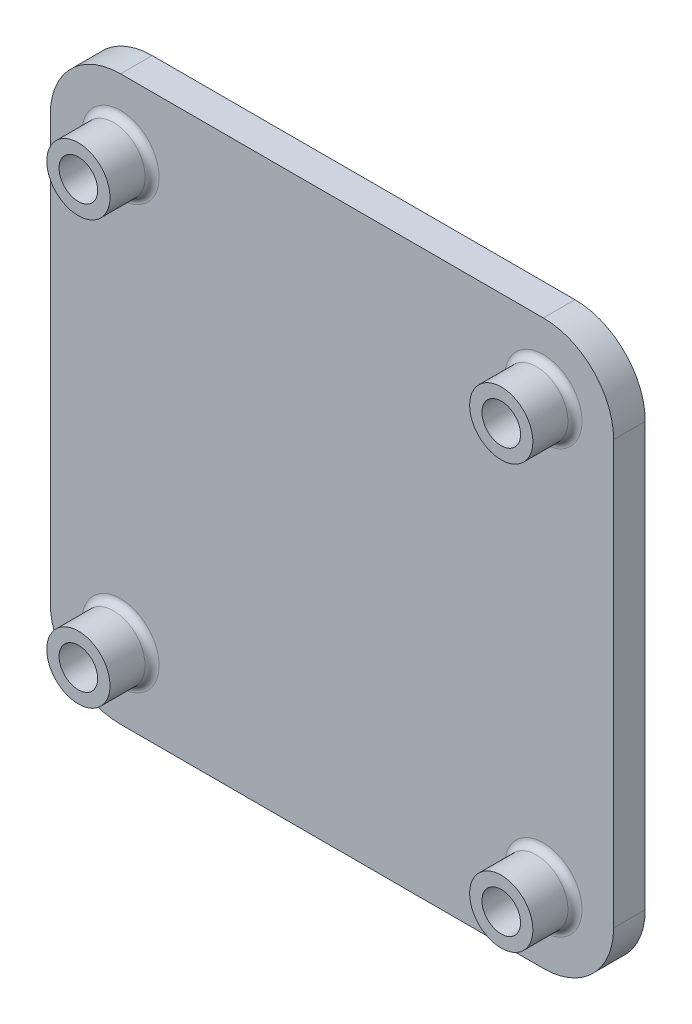
ISO-10303-21;
HEADER;
FILE_DESCRIPTION(('STEP AP214'),'2;1');
FILE_NAME('part.step','',(''),(''),'','','');
FILE_SCHEMA(('AUTOMOTIVE_DESIGN { 1 0 10303 214 1 1 1 1 }'));
ENDSEC;
DATA;
#1=APPLICATION_CONTEXT('core data for automotive mechanical design processes');
#2=APPLICATION_PROTOCOL_DEFINITION('international standard','automotive_design',2000,#1);
#3=PRODUCT_CONTEXT('',#1,'mechanical');
#4=PRODUCT('Part','Part','',(#3));
#5=PRODUCT_RELATED_PRODUCT_CATEGORY('part','',(#4));
#6=PRODUCT_DEFINITION_FORMATION('','',#4);
#7=PRODUCT_DEFINITION_CONTEXT('part definition',#1,'design');
#8=PRODUCT_DEFINITION('design','',#6,#7);
#9=PRODUCT_DEFINITION_SHAPE('','',#8);
#10=(LENGTH_UNIT() NAMED_UNIT(*) SI_UNIT(.MILLI.,.METRE.));
#11=(NAMED_UNIT(*) PLANE_ANGLE_UNIT() SI_UNIT($,.RADIAN.));
#12=(NAMED_UNIT(*) SI_UNIT($,.STERADIAN.) SOLID_ANGLE_UNIT());
#13=UNCERTAINTY_MEASURE_WITH_UNIT(LENGTH_MEASURE(1.E-05),#10,'distance_accuracy_value','');
#14=(GEOMETRIC_REPRESENTATION_CONTEXT(3) GLOBAL_UNCERTAINTY_ASSIGNED_CONTEXT((#13)) GLOBAL_UNIT_ASSIGNED_CONTEXT((#10,
#11,#12)) REPRESENTATION_CONTEXT('',''));
#15=CARTESIAN_POINT('',(0.,0.,0.));
#16=DIRECTION('',(0.,0.,1.));
#17=DIRECTION('',(1.,0.,0.));
#18=AXIS2_PLACEMENT_3D('',#15,#16,#17);
#19=CARTESIAN_POINT('',(40.1,-40.1,4.5));
#20=DIRECTION('',(-1.,0.,0.));
#21=DIRECTION('',(0.,0.,1.));
#22=AXIS2_PLACEMENT_3D('',#19,#20,#21);
#23=PLANE('',#22);
#24=DIRECTION('',(0.,1.,0.));
#25=VECTOR('',#24,1.);
#26=CARTESIAN_POINT('',(40.1,-40.1,4.5));
#27=LINE('',#26,#25);
#28=CARTESIAN_POINT('',(40.1,-30.1,4.5));
#29=VERTEX_POINT('',#28);
#30=CARTESIAN_POINT('',(40.1,30.1,4.5));
#31=VERTEX_POINT('',#30);
#32=EDGE_CURVE('E121',#29,#31,#27,.T.);
#33=ORIENTED_EDGE('',*,*,#32,.F.);
#34=DIRECTION('',(0.,0.,-1.));
#35=VECTOR('',#34,1.);
#36=CARTESIAN_POINT('',(40.1,-30.1,4.5));
#37=LINE('',#36,#35);
#38=CARTESIAN_POINT('',(40.1,-30.1,0.));
#39=VERTEX_POINT('',#38);
#40=EDGE_CURVE('E106',#29,#39,#37,.T.);
#41=ORIENTED_EDGE('',*,*,#40,.T.);
#42=DIRECTION('',(0.,1.,0.));
#43=VECTOR('',#42,1.);
#44=CARTESIAN_POINT('',(40.1,-40.1,0.));
#45=LINE('',#44,#43);
#46=CARTESIAN_POINT('',(40.1,30.1,0.));
#47=VERTEX_POINT('',#46);
#48=EDGE_CURVE('E118',#39,#47,#45,.T.);
#49=ORIENTED_EDGE('',*,*,#48,.T.);
#50=DIRECTION('',(0.,0.,-1.));
#51=VECTOR('',#50,1.);
#52=CARTESIAN_POINT('',(40.1,30.1,4.5));
#53=LINE('',#52,#51);
#54=EDGE_CURVE('E123',#47,#31,#53,.F.);
#55=ORIENTED_EDGE('',*,*,#54,.T.);
#56=EDGE_LOOP('',(#33,#41,#49,#55));
#57=FACE_BOUND('',#56,.T.);
#58=ADVANCED_FACE('F35',(#57),#23,.F.);
#59=CARTESIAN_POINT('',(-40.1,40.1,4.5));
#60=DIRECTION('',(0.,-1.,0.));
#61=DIRECTION('',(0.,0.,-1.));
#62=AXIS2_PLACEMENT_3D('',#59,#60,#61);
#63=PLANE('',#62);
#64=DIRECTION('',(-1.,0.,0.));
#65=VECTOR('',#64,1.);
#66=CARTESIAN_POINT('',(-40.1,40.1,0.));
#67=LINE('',#66,#65);
#68=CARTESIAN_POINT('',(30.1,40.1,0.));
#69=VERTEX_POINT('',#68);
#70=CARTESIAN_POINT('',(-30.1,40.1,0.));
#71=VERTEX_POINT('',#70);
#72=EDGE_CURVE('E127',#69,#71,#67,.T.);
#73=ORIENTED_EDGE('',*,*,#72,.T.);
#74=DIRECTION('',(0.,0.,-1.));
#75=VECTOR('',#74,1.);
#76=CARTESIAN_POINT('',(-30.1,40.1,4.5));
#77=LINE('',#76,#75);
#78=CARTESIAN_POINT('',(-30.1,40.1,4.5));
#79=VERTEX_POINT('',#78);
#80=EDGE_CURVE('E165',#71,#79,#77,.F.);
#81=ORIENTED_EDGE('',*,*,#80,.T.);
#82=DIRECTION('',(-1.,0.,0.));
#83=VECTOR('',#82,1.);
#84=CARTESIAN_POINT('',(-40.1,40.1,4.5));
#85=LINE('',#84,#83);
#86=CARTESIAN_POINT('',(30.1,40.1,4.5));
#87=VERTEX_POINT('',#86);
#88=EDGE_CURVE('E266',#87,#79,#85,.T.);
#89=ORIENTED_EDGE('',*,*,#88,.F.);
#90=DIRECTION('',(0.,0.,-1.));
#91=VECTOR('',#90,1.);
#92=CARTESIAN_POINT('',(30.1,40.1,4.5));
#93=LINE('',#92,#91);
#94=EDGE_CURVE('E162',#87,#69,#93,.T.);
#95=ORIENTED_EDGE('',*,*,#94,.T.);
#96=EDGE_LOOP('',(#73,#81,#89,#95));
#97=FACE_BOUND('',#96,.T.);
#98=ADVANCED_FACE('F204',(#97),#63,.F.);
#99=CARTESIAN_POINT('',(-40.1,-40.1,4.5));
#100=DIRECTION('',(1.,0.,0.));
#101=DIRECTION('',(0.,0.,-1.));
#102=AXIS2_PLACEMENT_3D('',#99,#100,#101);
#103=PLANE('',#102);
#104=DIRECTION('',(0.,-1.,0.));
#105=VECTOR('',#104,1.);
#106=CARTESIAN_POINT('',(-40.1,-40.1,0.));
#107=LINE('',#106,#105);
#108=CARTESIAN_POINT('',(-40.1,30.1,0.));
#109=VERTEX_POINT('',#108);
#110=CARTESIAN_POINT('',(-40.1,-30.1,0.));
#111=VERTEX_POINT('',#110);
#112=EDGE_CURVE('E131',#109,#111,#107,.T.);
#113=ORIENTED_EDGE('',*,*,#112,.T.);
#114=DIRECTION('',(0.,0.,-1.));
#115=VECTOR('',#114,1.);
#116=CARTESIAN_POINT('',(-40.1,-30.1,4.5));
#117=LINE('',#116,#115);
#118=CARTESIAN_POINT('',(-40.1,-30.1,4.5));
#119=VERTEX_POINT('',#118);
#120=EDGE_CURVE('E50',#111,#119,#117,.F.);
#121=ORIENTED_EDGE('',*,*,#120,.T.);
#122=DIRECTION('',(0.,-1.,0.));
#123=VECTOR('',#122,1.);
#124=CARTESIAN_POINT('',(-40.1,-40.1,4.5));
#125=LINE('',#124,#123);
#126=CARTESIAN_POINT('',(-40.1,30.1,4.5));
#127=VERTEX_POINT('',#126);
#128=EDGE_CURVE('E267',#127,#119,#125,.T.);
#129=ORIENTED_EDGE('',*,*,#128,.F.);
#130=DIRECTION('',(0.,0.,-1.));
#131=VECTOR('',#130,1.);
#132=CARTESIAN_POINT('',(-40.1,30.1,4.5));
#133=LINE('',#132,#131);
#134=EDGE_CURVE('E158',#127,#109,#133,.T.);
#135=ORIENTED_EDGE('',*,*,#134,.T.);
#136=EDGE_LOOP('',(#113,#121,#129,#135));
#137=FACE_BOUND('',#136,.T.);
#138=ADVANCED_FACE('F209',(#137),#103,.F.);
#139=CARTESIAN_POINT('',(-40.1,-40.1,4.5));
#140=DIRECTION('',(0.,1.,0.));
#141=DIRECTION('',(0.,0.,1.));
#142=AXIS2_PLACEMENT_3D('',#139,#140,#141);
#143=PLANE('',#142);
#144=DIRECTION('',(1.,0.,0.));
#145=VECTOR('',#144,1.);
#146=CARTESIAN_POINT('',(-40.1,-40.1,0.));
#147=LINE('',#146,#145);
#148=CARTESIAN_POINT('',(-30.1,-40.1,0.));
#149=VERTEX_POINT('',#148);
#150=CARTESIAN_POINT('',(30.1,-40.1,0.));
#151=VERTEX_POINT('',#150);
#152=EDGE_CURVE('E141',#149,#151,#147,.T.);
#153=ORIENTED_EDGE('',*,*,#152,.T.);
#154=DIRECTION('',(0.,0.,-1.));
#155=VECTOR('',#154,1.);
#156=CARTESIAN_POINT('',(30.1,-40.1,4.5));
#157=LINE('',#156,#155);
#158=CARTESIAN_POINT('',(30.1,-40.1,4.5));
#159=VERTEX_POINT('',#158);
#160=EDGE_CURVE('E107',#151,#159,#157,.F.);
#161=ORIENTED_EDGE('',*,*,#160,.T.);
#162=DIRECTION('',(1.,0.,0.));
#163=VECTOR('',#162,1.);
#164=CARTESIAN_POINT('',(-40.1,-40.1,4.5));
#165=LINE('',#164,#163);
#166=CARTESIAN_POINT('',(-30.1,-40.1,4.5));
#167=VERTEX_POINT('',#166);
#168=EDGE_CURVE('E137',#167,#159,#165,.T.);
#169=ORIENTED_EDGE('',*,*,#168,.F.);
#170=DIRECTION('',(0.,0.,-1.));
#171=VECTOR('',#170,1.);
#172=CARTESIAN_POINT('',(-30.1,-40.1,4.5));
#173=LINE('',#172,#171);
#174=EDGE_CURVE('E112',#167,#149,#173,.T.);
#175=ORIENTED_EDGE('',*,*,#174,.T.);
#176=EDGE_LOOP('',(#153,#161,#169,#175));
#177=FACE_BOUND('',#176,.T.);
#178=ADVANCED_FACE('F274',(#177),#143,.F.);
#179=CARTESIAN_POINT('',(0.,0.,4.5));
#180=DIRECTION('',(0.,0.,-1.));
#181=DIRECTION('',(-1.,0.,0.));
#182=AXIS2_PLACEMENT_3D('',#179,#180,#181);
#183=PLANE('',#182);
#184=CARTESIAN_POINT('',(-30.1,30.1,4.5));
#185=DIRECTION('',(0.,0.,-1.));
#186=DIRECTION('',(-1.,0.,0.));
#187=AXIS2_PLACEMENT_3D('',#184,#185,#186);
#188=CIRCLE('',#187,5.5);
#189=CARTESIAN_POINT('',(-35.6,30.1,4.5));
#190=VERTEX_POINT('',#189);
#191=EDGE_CURVE('E179',#190,#190,#188,.T.);
#192=ORIENTED_EDGE('',*,*,#191,.T.);
#193=EDGE_LOOP('',(#192));
#194=FACE_BOUND('',#193,.T.);
#195=CARTESIAN_POINT('',(-30.1,-30.1,4.5));
#196=DIRECTION('',(0.,0.,-1.));
#197=DIRECTION('',(-1.,0.,0.));
#198=AXIS2_PLACEMENT_3D('',#195,#196,#197);
#199=CIRCLE('',#198,5.5);
#200=CARTESIAN_POINT('',(-35.6,-30.1,4.5));
#201=VERTEX_POINT('',#200);
#202=EDGE_CURVE('E176',#201,#201,#199,.T.);
#203=ORIENTED_EDGE('',*,*,#202,.T.);
#204=EDGE_LOOP('',(#203));
#205=FACE_BOUND('',#204,.T.);
#206=CARTESIAN_POINT('',(30.1,-30.1,4.5));
#207=DIRECTION('',(0.,0.,-1.));
#208=DIRECTION('',(-1.,0.,0.));
#209=AXIS2_PLACEMENT_3D('',#206,#207,#208);
#210=CIRCLE('',#209,5.5);
#211=CARTESIAN_POINT('',(24.6,-30.1,4.5));
#212=VERTEX_POINT('',#211);
#213=EDGE_CURVE('E173',#212,#212,#210,.T.);
#214=ORIENTED_EDGE('',*,*,#213,.T.);
#215=EDGE_LOOP('',(#214));
#216=FACE_BOUND('',#215,.T.);
#217=CARTESIAN_POINT('',(30.1,30.1,4.5));
#218=DIRECTION('',(0.,0.,-1.));
#219=DIRECTION('',(-1.,0.,0.));
#220=AXIS2_PLACEMENT_3D('',#217,#218,#219);
#221=CIRCLE('',#220,5.5);
#222=CARTESIAN_POINT('',(24.6,30.1,4.5));
#223=VERTEX_POINT('',#222);
#224=EDGE_CURVE('E170',#223,#223,#221,.T.);
#225=ORIENTED_EDGE('',*,*,#224,.T.);
#226=EDGE_LOOP('',(#225));
#227=FACE_BOUND('',#226,.T.);
#228=ORIENTED_EDGE('',*,*,#168,.T.);
#229=CARTESIAN_POINT('',(30.1,-30.1,4.5));
#230=DIRECTION('',(0.,0.,-1.));
#231=DIRECTION('',(-1.,0.,0.));
#232=AXIS2_PLACEMENT_3D('',#229,#230,#231);
#233=CIRCLE('',#232,10.);
#234=EDGE_CURVE('E156',#159,#29,#233,.F.);
#235=ORIENTED_EDGE('',*,*,#234,.T.);
#236=ORIENTED_EDGE('',*,*,#32,.T.);
#237=CARTESIAN_POINT('',(30.1,30.1,4.5));
#238=DIRECTION('',(0.,0.,-1.));
#239=DIRECTION('',(-1.,0.,0.));
#240=AXIS2_PLACEMENT_3D('',#237,#238,#239);
#241=CIRCLE('',#240,10.);
#242=EDGE_CURVE('E151',#31,#87,#241,.F.);
#243=ORIENTED_EDGE('',*,*,#242,.T.);
#244=ORIENTED_EDGE('',*,*,#88,.T.);
#245=CARTESIAN_POINT('',(-30.1,30.1,4.5));
#246=DIRECTION('',(0.,0.,-1.));
#247=DIRECTION('',(-1.,0.,0.));
#248=AXIS2_PLACEMENT_3D('',#245,#246,#247);
#249=CIRCLE('',#248,10.);
#250=EDGE_CURVE('E57',#79,#127,#249,.F.);
#251=ORIENTED_EDGE('',*,*,#250,.T.);
#252=ORIENTED_EDGE('',*,*,#128,.T.);
#253=CARTESIAN_POINT('',(-30.1,-30.1,4.5));
#254=DIRECTION('',(0.,0.,-1.));
#255=DIRECTION('',(-1.,0.,0.));
#256=AXIS2_PLACEMENT_3D('',#253,#254,#255);
#257=CIRCLE('',#256,10.);
#258=EDGE_CURVE('E154',#119,#167,#257,.F.);
#259=ORIENTED_EDGE('',*,*,#258,.T.);
#260=EDGE_LOOP('',(#228,#235,#236,#243,#244,#251,#252,#259));
#261=FACE_BOUND('',#260,.T.);
#262=ADVANCED_FACE('F271',(#194,#205,#216,#227,#261),#183,.F.);
#263=CARTESIAN_POINT('',(0.,0.,0.));
#264=DIRECTION('',(0.,0.,-1.));
#265=DIRECTION('',(-1.,0.,0.));
#266=AXIS2_PLACEMENT_3D('',#263,#264,#265);
#267=PLANE('',#266);
#268=CARTESIAN_POINT('',(30.1,30.1,0.));
#269=DIRECTION('',(0.,0.,-1.));
#270=DIRECTION('',(-1.,0.,0.));
#271=AXIS2_PLACEMENT_3D('',#268,#269,#270);
#272=CIRCLE('',#271,2.74999999999998);
#273=CARTESIAN_POINT('',(27.35,30.1,0.));
#274=VERTEX_POINT('',#273);
#275=EDGE_CURVE('E250',#274,#274,#272,.T.);
#276=ORIENTED_EDGE('',*,*,#275,.F.);
#277=EDGE_LOOP('',(#276));
#278=FACE_BOUND('',#277,.T.);
#279=CARTESIAN_POINT('',(-30.1,30.1,0.));
#280=DIRECTION('',(0.,0.,-1.));
#281=DIRECTION('',(-1.,0.,0.));
#282=AXIS2_PLACEMENT_3D('',#279,#280,#281);
#283=CIRCLE('',#282,2.74999999999999);
#284=CARTESIAN_POINT('',(-32.85,30.1,0.));
#285=VERTEX_POINT('',#284);
#286=EDGE_CURVE('E254',#285,#285,#283,.T.);
#287=ORIENTED_EDGE('',*,*,#286,.F.);
#288=EDGE_LOOP('',(#287));
#289=FACE_BOUND('',#288,.T.);
#290=CARTESIAN_POINT('',(30.1,-30.1,0.));
#291=DIRECTION('',(0.,0.,-1.));
#292=DIRECTION('',(-1.,0.,0.));
#293=AXIS2_PLACEMENT_3D('',#290,#291,#292);
#294=CIRCLE('',#293,2.74999999999999);
#295=CARTESIAN_POINT('',(27.35,-30.1,0.));
#296=VERTEX_POINT('',#295);
#297=EDGE_CURVE('E134',#296,#296,#294,.T.);
#298=ORIENTED_EDGE('',*,*,#297,.F.);
#299=EDGE_LOOP('',(#298));
#300=FACE_BOUND('',#299,.T.);
#301=CARTESIAN_POINT('',(-30.1,-30.1,0.));
#302=DIRECTION('',(0.,0.,-1.));
#303=DIRECTION('',(-1.,0.,0.));
#304=AXIS2_PLACEMENT_3D('',#301,#302,#303);
#305=CIRCLE('',#304,2.74999999999999);
#306=CARTESIAN_POINT('',(-32.85,-30.1,0.));
#307=VERTEX_POINT('',#306);
#308=EDGE_CURVE('E128',#307,#307,#305,.T.);
#309=ORIENTED_EDGE('',*,*,#308,.F.);
#310=EDGE_LOOP('',(#309));
#311=FACE_BOUND('',#310,.T.);
#312=ORIENTED_EDGE('',*,*,#48,.F.);
#313=CARTESIAN_POINT('',(30.1,-30.1,0.));
#314=DIRECTION('',(0.,0.,-1.));
#315=DIRECTION('',(-1.,0.,0.));
#316=AXIS2_PLACEMENT_3D('',#313,#314,#315);
#317=CIRCLE('',#316,10.);
#318=EDGE_CURVE('E102',#39,#151,#317,.T.);
#319=ORIENTED_EDGE('',*,*,#318,.T.);
#320=ORIENTED_EDGE('',*,*,#152,.F.);
#321=CARTESIAN_POINT('',(-30.1,-30.1,0.));
#322=DIRECTION('',(0.,0.,-1.));
#323=DIRECTION('',(-1.,0.,0.));
#324=AXIS2_PLACEMENT_3D('',#321,#322,#323);
#325=CIRCLE('',#324,10.);
#326=EDGE_CURVE('E113',#149,#111,#325,.T.);
#327=ORIENTED_EDGE('',*,*,#326,.T.);
#328=ORIENTED_EDGE('',*,*,#112,.F.);
#329=CARTESIAN_POINT('',(-30.1,30.1,0.));
#330=DIRECTION('',(0.,0.,-1.));
#331=DIRECTION('',(-1.,0.,0.));
#332=AXIS2_PLACEMENT_3D('',#329,#330,#331);
#333=CIRCLE('',#332,10.);
#334=EDGE_CURVE('E145',#109,#71,#333,.T.);
#335=ORIENTED_EDGE('',*,*,#334,.T.);
#336=ORIENTED_EDGE('',*,*,#72,.F.);
#337=CARTESIAN_POINT('',(30.1,30.1,0.));
#338=DIRECTION('',(0.,0.,-1.));
#339=DIRECTION('',(-1.,0.,0.));
#340=AXIS2_PLACEMENT_3D('',#337,#338,#339);
#341=CIRCLE('',#340,10.);
#342=EDGE_CURVE('E122',#69,#47,#341,.T.);
#343=ORIENTED_EDGE('',*,*,#342,.T.);
#344=EDGE_LOOP('',(#312,#319,#320,#327,#328,#335,#336,#343));
#345=FACE_BOUND('',#344,.T.);
#346=ADVANCED_FACE('F125',(#278,#289,#300,#311,#345),#267,.T.);
#347=CARTESIAN_POINT('',(-30.1,-30.1,0.));
#348=DIRECTION('',(0.,0.,-1.));
#349=DIRECTION('',(-1.,0.,0.));
#350=AXIS2_PLACEMENT_3D('',#347,#348,#349);
#351=CYLINDRICAL_SURFACE('',#350,2.74999999999999);
#352=ORIENTED_EDGE('',*,*,#308,.T.);
#353=EDGE_LOOP('',(#352));
#354=FACE_BOUND('',#353,.T.);
#355=CARTESIAN_POINT('',(-30.1,-30.1,10.5));
#356=DIRECTION('',(0.,0.,1.));
#357=DIRECTION('',(1.,0.,0.));
#358=AXIS2_PLACEMENT_3D('',#355,#356,#357);
#359=CIRCLE('',#358,2.74999999999999);
#360=CARTESIAN_POINT('',(-27.35,-30.1,10.5));
#361=VERTEX_POINT('',#360);
#362=EDGE_CURVE('E491',#361,#361,#359,.T.);
#363=ORIENTED_EDGE('',*,*,#362,.T.);
#364=EDGE_LOOP('',(#363));
#365=FACE_BOUND('',#364,.T.);
#366=ADVANCED_FACE('F289',(#354,#365),#351,.F.);
#367=CARTESIAN_POINT('',(30.1,-30.1,0.));
#368=DIRECTION('',(0.,0.,-1.));
#369=DIRECTION('',(-1.,0.,0.));
#370=AXIS2_PLACEMENT_3D('',#367,#368,#369);
#371=CYLINDRICAL_SURFACE('',#370,2.74999999999999);
#372=ORIENTED_EDGE('',*,*,#297,.T.);
#373=EDGE_LOOP('',(#372));
#374=FACE_BOUND('',#373,.T.);
#375=CARTESIAN_POINT('',(30.1,-30.1,10.5));
#376=DIRECTION('',(0.,0.,1.));
#377=DIRECTION('',(1.,0.,0.));
#378=AXIS2_PLACEMENT_3D('',#375,#376,#377);
#379=CIRCLE('',#378,2.74999999999999);
#380=CARTESIAN_POINT('',(32.85,-30.1,10.5));
#381=VERTEX_POINT('',#380);
#382=EDGE_CURVE('E506',#381,#381,#379,.F.);
#383=ORIENTED_EDGE('',*,*,#382,.F.);
#384=EDGE_LOOP('',(#383));
#385=FACE_BOUND('',#384,.T.);
#386=ADVANCED_FACE('F296',(#374,#385),#371,.F.);
#387=CARTESIAN_POINT('',(-30.1,30.1,0.));
#388=DIRECTION('',(0.,0.,-1.));
#389=DIRECTION('',(-1.,0.,0.));
#390=AXIS2_PLACEMENT_3D('',#387,#388,#389);
#391=CYLINDRICAL_SURFACE('',#390,2.74999999999999);
#392=ORIENTED_EDGE('',*,*,#286,.T.);
#393=EDGE_LOOP('',(#392));
#394=FACE_BOUND('',#393,.T.);
#395=CARTESIAN_POINT('',(-30.1,30.1,10.5));
#396=DIRECTION('',(0.,0.,1.));
#397=DIRECTION('',(1.,0.,0.));
#398=AXIS2_PLACEMENT_3D('',#395,#396,#397);
#399=CIRCLE('',#398,2.74999999999999);
#400=CARTESIAN_POINT('',(-27.35,30.1,10.5));
#401=VERTEX_POINT('',#400);
#402=EDGE_CURVE('E251',#401,#401,#399,.F.);
#403=ORIENTED_EDGE('',*,*,#402,.F.);
#404=EDGE_LOOP('',(#403));
#405=FACE_BOUND('',#404,.T.);
#406=ADVANCED_FACE('F300',(#394,#405),#391,.F.);
#407=CARTESIAN_POINT('',(30.1,30.1,0.));
#408=DIRECTION('',(0.,0.,-1.));
#409=DIRECTION('',(-1.,0.,0.));
#410=AXIS2_PLACEMENT_3D('',#407,#408,#409);
#411=CYLINDRICAL_SURFACE('',#410,2.74999999999999);
#412=ORIENTED_EDGE('',*,*,#275,.T.);
#413=EDGE_LOOP('',(#412));
#414=FACE_BOUND('',#413,.T.);
#415=CARTESIAN_POINT('',(30.1,30.1,10.5));
#416=DIRECTION('',(0.,0.,1.));
#417=DIRECTION('',(1.,0.,0.));
#418=AXIS2_PLACEMENT_3D('',#415,#416,#417);
#419=CIRCLE('',#418,2.74999999999999);
#420=CARTESIAN_POINT('',(32.85,30.1,10.5));
#421=VERTEX_POINT('',#420);
#422=EDGE_CURVE('E500',#421,#421,#419,.T.);
#423=ORIENTED_EDGE('',*,*,#422,.T.);
#424=EDGE_LOOP('',(#423));
#425=FACE_BOUND('',#424,.T.);
#426=ADVANCED_FACE('F217',(#414,#425),#411,.F.);
#427=CARTESIAN_POINT('',(30.1,-30.1,4.5));
#428=DIRECTION('',(0.,0.,-1.));
#429=DIRECTION('',(-1.,0.,0.));
#430=AXIS2_PLACEMENT_3D('',#427,#428,#429);
#431=CYLINDRICAL_SURFACE('',#430,10.);
#432=ORIENTED_EDGE('',*,*,#234,.F.);
#433=ORIENTED_EDGE('',*,*,#160,.F.);
#434=ORIENTED_EDGE('',*,*,#318,.F.);
#435=ORIENTED_EDGE('',*,*,#40,.F.);
#436=EDGE_LOOP('',(#432,#433,#434,#435));
#437=FACE_BOUND('',#436,.T.);
#438=ADVANCED_FACE('F105',(#437),#431,.T.);
#439=CARTESIAN_POINT('',(-30.1,-30.1,4.5));
#440=DIRECTION('',(0.,0.,-1.));
#441=DIRECTION('',(-1.,0.,0.));
#442=AXIS2_PLACEMENT_3D('',#439,#440,#441);
#443=CYLINDRICAL_SURFACE('',#442,10.);
#444=ORIENTED_EDGE('',*,*,#258,.F.);
#445=ORIENTED_EDGE('',*,*,#120,.F.);
#446=ORIENTED_EDGE('',*,*,#326,.F.);
#447=ORIENTED_EDGE('',*,*,#174,.F.);
#448=EDGE_LOOP('',(#444,#445,#446,#447));
#449=FACE_BOUND('',#448,.T.);
#450=ADVANCED_FACE('F216',(#449),#443,.T.);
#451=CARTESIAN_POINT('',(-30.1,30.1,4.5));
#452=DIRECTION('',(0.,0.,-1.));
#453=DIRECTION('',(-1.,0.,0.));
#454=AXIS2_PLACEMENT_3D('',#451,#452,#453);
#455=CYLINDRICAL_SURFACE('',#454,10.);
#456=ORIENTED_EDGE('',*,*,#250,.F.);
#457=ORIENTED_EDGE('',*,*,#80,.F.);
#458=ORIENTED_EDGE('',*,*,#334,.F.);
#459=ORIENTED_EDGE('',*,*,#134,.F.);
#460=EDGE_LOOP('',(#456,#457,#458,#459));
#461=FACE_BOUND('',#460,.T.);
#462=ADVANCED_FACE('F220',(#461),#455,.T.);
#463=CARTESIAN_POINT('',(30.1,30.1,4.5));
#464=DIRECTION('',(0.,0.,-1.));
#465=DIRECTION('',(-1.,0.,0.));
#466=AXIS2_PLACEMENT_3D('',#463,#464,#465);
#467=CYLINDRICAL_SURFACE('',#466,10.);
#468=ORIENTED_EDGE('',*,*,#242,.F.);
#469=ORIENTED_EDGE('',*,*,#54,.F.);
#470=ORIENTED_EDGE('',*,*,#342,.F.);
#471=ORIENTED_EDGE('',*,*,#94,.F.);
#472=EDGE_LOOP('',(#468,#469,#470,#471));
#473=FACE_BOUND('',#472,.T.);
#474=ADVANCED_FACE('F224',(#473),#467,.T.);
#475=CARTESIAN_POINT('',(-30.1,30.1,10.5));
#476=DIRECTION('',(0.,0.,-1.));
#477=DIRECTION('',(-1.,0.,0.));
#478=AXIS2_PLACEMENT_3D('',#475,#476,#477);
#479=CYLINDRICAL_SURFACE('',#478,4.5);
#480=CARTESIAN_POINT('',(-30.1,30.1,5.5));
#481=DIRECTION('',(0.,0.,-1.));
#482=DIRECTION('',(-1.,0.,0.));
#483=AXIS2_PLACEMENT_3D('',#480,#481,#482);
#484=CIRCLE('',#483,4.5);
#485=CARTESIAN_POINT('',(-34.6,30.1,5.5));
#486=VERTEX_POINT('',#485);
#487=EDGE_CURVE('E167',#486,#486,#484,.F.);
#488=ORIENTED_EDGE('',*,*,#487,.T.);
#489=EDGE_LOOP('',(#488));
#490=FACE_BOUND('',#489,.T.);
#491=CARTESIAN_POINT('',(-30.1,30.1,10.5));
#492=DIRECTION('',(0.,0.,1.));
#493=DIRECTION('',(1.,0.,0.));
#494=AXIS2_PLACEMENT_3D('',#491,#492,#493);
#495=CIRCLE('',#494,4.5);
#496=CARTESIAN_POINT('',(-25.6,30.1,10.5));
#497=VERTEX_POINT('',#496);
#498=EDGE_CURVE('E248',#497,#497,#495,.T.);
#499=ORIENTED_EDGE('',*,*,#498,.F.);
#500=EDGE_LOOP('',(#499));
#501=FACE_BOUND('',#500,.T.);
#502=ADVANCED_FACE('F228',(#490,#501),#479,.T.);
#503=CARTESIAN_POINT('',(-30.1,30.1,10.5));
#504=DIRECTION('',(0.,0.,1.));
#505=DIRECTION('',(1.,0.,0.));
#506=AXIS2_PLACEMENT_3D('',#503,#504,#505);
#507=PLANE('',#506);
#508=ORIENTED_EDGE('',*,*,#402,.T.);
#509=EDGE_LOOP('',(#508));
#510=FACE_BOUND('',#509,.T.);
#511=ORIENTED_EDGE('',*,*,#498,.T.);
#512=EDGE_LOOP('',(#511));
#513=FACE_BOUND('',#512,.T.);
#514=ADVANCED_FACE('F244',(#510,#513),#507,.T.);
#515=CARTESIAN_POINT('',(30.1,30.1,10.5));
#516=DIRECTION('',(0.,0.,-1.));
#517=DIRECTION('',(-1.,0.,0.));
#518=AXIS2_PLACEMENT_3D('',#515,#516,#517);
#519=CYLINDRICAL_SURFACE('',#518,4.5);
#520=CARTESIAN_POINT('',(30.1,30.1,5.5));
#521=DIRECTION('',(0.,0.,-1.));
#522=DIRECTION('',(-1.,0.,0.));
#523=AXIS2_PLACEMENT_3D('',#520,#521,#522);
#524=CIRCLE('',#523,4.5);
#525=CARTESIAN_POINT('',(25.6,30.1,5.5));
#526=VERTEX_POINT('',#525);
#527=EDGE_CURVE('E11',#526,#526,#524,.F.);
#528=ORIENTED_EDGE('',*,*,#527,.T.);
#529=EDGE_LOOP('',(#528));
#530=FACE_BOUND('',#529,.T.);
#531=CARTESIAN_POINT('',(30.1,30.1,10.5));
#532=DIRECTION('',(0.,0.,-1.));
#533=DIRECTION('',(-1.,0.,0.));
#534=AXIS2_PLACEMENT_3D('',#531,#532,#533);
#535=CIRCLE('',#534,4.5);
#536=CARTESIAN_POINT('',(25.6,30.1,10.5));
#537=VERTEX_POINT('',#536);
#538=EDGE_CURVE('E257',#537,#537,#535,.T.);
#539=ORIENTED_EDGE('',*,*,#538,.T.);
#540=EDGE_LOOP('',(#539));
#541=FACE_BOUND('',#540,.T.);
#542=ADVANCED_FACE('F310',(#530,#541),#519,.T.);
#543=CARTESIAN_POINT('',(30.1,30.1,10.5));
#544=DIRECTION('',(0.,0.,1.));
#545=DIRECTION('',(-1.,0.,0.));
#546=AXIS2_PLACEMENT_3D('',#543,#544,#545);
#547=PLANE('',#546);
#548=ORIENTED_EDGE('',*,*,#422,.F.);
#549=EDGE_LOOP('',(#548));
#550=FACE_BOUND('',#549,.T.);
#551=ORIENTED_EDGE('',*,*,#538,.F.);
#552=EDGE_LOOP('',(#551));
#553=FACE_BOUND('',#552,.T.);
#554=ADVANCED_FACE('F314',(#550,#553),#547,.T.);
#555=CARTESIAN_POINT('',(-30.1,-30.1,10.5));
#556=DIRECTION('',(0.,0.,-1.));
#557=DIRECTION('',(-1.,0.,0.));
#558=AXIS2_PLACEMENT_3D('',#555,#556,#557);
#559=CYLINDRICAL_SURFACE('',#558,4.5);
#560=CARTESIAN_POINT('',(-30.1,-30.1,5.5));
#561=DIRECTION('',(0.,0.,-1.));
#562=DIRECTION('',(-1.,0.,0.));
#563=AXIS2_PLACEMENT_3D('',#560,#561,#562);
#564=CIRCLE('',#563,4.5);
#565=CARTESIAN_POINT('',(-34.6,-30.1,5.5));
#566=VERTEX_POINT('',#565);
#567=EDGE_CURVE('E182',#566,#566,#564,.F.);
#568=ORIENTED_EDGE('',*,*,#567,.T.);
#569=EDGE_LOOP('',(#568));
#570=FACE_BOUND('',#569,.T.);
#571=CARTESIAN_POINT('',(-30.1,-30.1,10.5));
#572=DIRECTION('',(0.,0.,-1.));
#573=DIRECTION('',(1.,0.,0.));
#574=AXIS2_PLACEMENT_3D('',#571,#572,#573);
#575=CIRCLE('',#574,4.5);
#576=CARTESIAN_POINT('',(-25.6,-30.1,10.5));
#577=VERTEX_POINT('',#576);
#578=EDGE_CURVE('E494',#577,#577,#575,.T.);
#579=ORIENTED_EDGE('',*,*,#578,.T.);
#580=EDGE_LOOP('',(#579));
#581=FACE_BOUND('',#580,.T.);
#582=ADVANCED_FACE('F318',(#570,#581),#559,.T.);
#583=CARTESIAN_POINT('',(-30.1,-30.1,10.5));
#584=DIRECTION('',(0.,0.,1.));
#585=DIRECTION('',(1.,0.,0.));
#586=AXIS2_PLACEMENT_3D('',#583,#584,#585);
#587=PLANE('',#586);
#588=ORIENTED_EDGE('',*,*,#362,.F.);
#589=EDGE_LOOP('',(#588));
#590=FACE_BOUND('',#589,.T.);
#591=ORIENTED_EDGE('',*,*,#578,.F.);
#592=EDGE_LOOP('',(#591));
#593=FACE_BOUND('',#592,.T.);
#594=ADVANCED_FACE('F322',(#590,#593),#587,.T.);
#595=CARTESIAN_POINT('',(30.1,-30.1,10.5));
#596=DIRECTION('',(0.,0.,-1.));
#597=DIRECTION('',(-1.,0.,0.));
#598=AXIS2_PLACEMENT_3D('',#595,#596,#597);
#599=CYLINDRICAL_SURFACE('',#598,4.5);
#600=CARTESIAN_POINT('',(30.1,-30.1,5.5));
#601=DIRECTION('',(0.,0.,-1.));
#602=DIRECTION('',(-1.,0.,0.));
#603=AXIS2_PLACEMENT_3D('',#600,#601,#602);
#604=CIRCLE('',#603,4.5);
#605=CARTESIAN_POINT('',(25.6,-30.1,5.5));
#606=VERTEX_POINT('',#605);
#607=EDGE_CURVE('E43',#606,#606,#604,.F.);
#608=ORIENTED_EDGE('',*,*,#607,.T.);
#609=EDGE_LOOP('',(#608));
#610=FACE_BOUND('',#609,.T.);
#611=CARTESIAN_POINT('',(30.1,-30.1,10.5));
#612=DIRECTION('',(0.,0.,1.));
#613=DIRECTION('',(-1.,0.,0.));
#614=AXIS2_PLACEMENT_3D('',#611,#612,#613);
#615=CIRCLE('',#614,4.5);
#616=CARTESIAN_POINT('',(25.6,-30.1,10.5));
#617=VERTEX_POINT('',#616);
#618=EDGE_CURVE('E496',#617,#617,#615,.T.);
#619=ORIENTED_EDGE('',*,*,#618,.F.);
#620=EDGE_LOOP('',(#619));
#621=FACE_BOUND('',#620,.T.);
#622=ADVANCED_FACE('F187',(#610,#621),#599,.T.);
#623=CARTESIAN_POINT('',(30.1,-30.1,10.5));
#624=DIRECTION('',(0.,0.,1.));
#625=DIRECTION('',(-1.,0.,0.));
#626=AXIS2_PLACEMENT_3D('',#623,#624,#625);
#627=PLANE('',#626);
#628=ORIENTED_EDGE('',*,*,#382,.T.);
#629=EDGE_LOOP('',(#628));
#630=FACE_BOUND('',#629,.T.);
#631=ORIENTED_EDGE('',*,*,#618,.T.);
#632=EDGE_LOOP('',(#631));
#633=FACE_BOUND('',#632,.T.);
#634=ADVANCED_FACE('F231',(#630,#633),#627,.T.);
#635=CARTESIAN_POINT('',(-30.1,30.1,5.5));
#636=DIRECTION('',(0.,0.,-1.));
#637=DIRECTION('',(-1.,0.,0.));
#638=AXIS2_PLACEMENT_3D('',#635,#636,#637);
#639=TOROIDAL_SURFACE('',#638,5.5,1.);
#640=ORIENTED_EDGE('',*,*,#191,.F.);
#641=EDGE_LOOP('',(#640));
#642=FACE_BOUND('',#641,.T.);
#643=ORIENTED_EDGE('',*,*,#487,.F.);
#644=EDGE_LOOP('',(#643));
#645=FACE_BOUND('',#644,.T.);
#646=ADVANCED_FACE('F199',(#642,#645),#639,.F.);
#647=CARTESIAN_POINT('',(-30.1,-30.1,5.5));
#648=DIRECTION('',(0.,0.,-1.));
#649=DIRECTION('',(-1.,0.,0.));
#650=AXIS2_PLACEMENT_3D('',#647,#648,#649);
#651=TOROIDAL_SURFACE('',#650,5.5,1.);
#652=ORIENTED_EDGE('',*,*,#567,.F.);
#653=EDGE_LOOP('',(#652));
#654=FACE_BOUND('',#653,.T.);
#655=ORIENTED_EDGE('',*,*,#202,.F.);
#656=EDGE_LOOP('',(#655));
#657=FACE_BOUND('',#656,.T.);
#658=ADVANCED_FACE('F192',(#654,#657),#651,.F.);
#659=CARTESIAN_POINT('',(30.1,-30.1,5.5));
#660=DIRECTION('',(0.,0.,-1.));
#661=DIRECTION('',(-1.,0.,0.));
#662=AXIS2_PLACEMENT_3D('',#659,#660,#661);
#663=TOROIDAL_SURFACE('',#662,5.5,1.);
#664=ORIENTED_EDGE('',*,*,#213,.F.);
#665=EDGE_LOOP('',(#664));
#666=FACE_BOUND('',#665,.T.);
#667=ORIENTED_EDGE('',*,*,#607,.F.);
#668=EDGE_LOOP('',(#667));
#669=FACE_BOUND('',#668,.T.);
#670=ADVANCED_FACE('F190',(#666,#669),#663,.F.);
#671=CARTESIAN_POINT('',(30.1,30.1,5.5));
#672=DIRECTION('',(0.,0.,-1.));
#673=DIRECTION('',(-1.,0.,0.));
#674=AXIS2_PLACEMENT_3D('',#671,#672,#673);
#675=TOROIDAL_SURFACE('',#674,5.5,1.);
#676=ORIENTED_EDGE('',*,*,#527,.F.);
#677=EDGE_LOOP('',(#676));
#678=FACE_BOUND('',#677,.T.);
#679=ORIENTED_EDGE('',*,*,#224,.F.);
#680=EDGE_LOOP('',(#679));
#681=FACE_BOUND('',#680,.T.);
#682=ADVANCED_FACE('F37',(#678,#681),#675,.F.);
#683=CLOSED_SHELL('',(#58,#98,#138,#178,#262,#346,#366,#386,#406,#426,#438,#450,#462,#474,#502,
#514,#542,#554,#582,#594,#622,#634,#646,#658,#670,#682));
#684=MANIFOLD_SOLID_BREP('B2',#683);
#685=ADVANCED_BREP_SHAPE_REPRESENTATION('',(#18,#684),#14);
#686=SHAPE_DEFINITION_REPRESENTATION(#9,#685);
ENDSEC;
END-ISO-10303-21;
